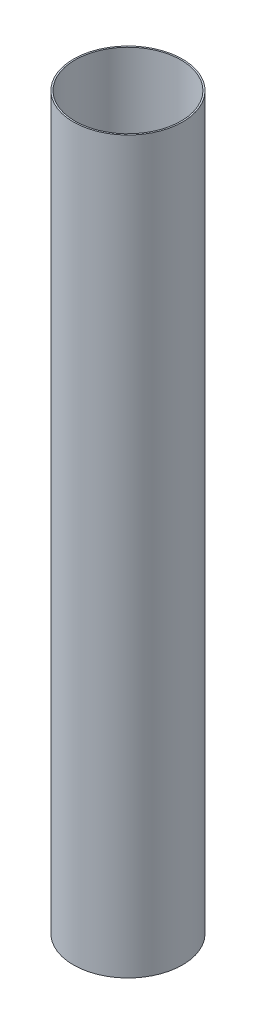
ISO-10303-21;
HEADER;
FILE_DESCRIPTION(('STEP AP214'),'2;1');
FILE_NAME('part.step','',(''),(''),'','','');
FILE_SCHEMA(('AUTOMOTIVE_DESIGN { 1 0 10303 214 1 1 1 1 }'));
ENDSEC;
DATA;
#1=APPLICATION_CONTEXT('core data for automotive mechanical design processes');
#2=APPLICATION_PROTOCOL_DEFINITION('international standard','automotive_design',2000,#1);
#3=PRODUCT_CONTEXT('',#1,'mechanical');
#4=PRODUCT('Part','Part','',(#3));
#5=PRODUCT_RELATED_PRODUCT_CATEGORY('part','',(#4));
#6=PRODUCT_DEFINITION_FORMATION('','',#4);
#7=PRODUCT_DEFINITION_CONTEXT('part definition',#1,'design');
#8=PRODUCT_DEFINITION('design','',#6,#7);
#9=PRODUCT_DEFINITION_SHAPE('','',#8);
#10=(LENGTH_UNIT() NAMED_UNIT(*) SI_UNIT(.MILLI.,.METRE.));
#11=(NAMED_UNIT(*) PLANE_ANGLE_UNIT() SI_UNIT($,.RADIAN.));
#12=(NAMED_UNIT(*) SI_UNIT($,.STERADIAN.) SOLID_ANGLE_UNIT());
#13=UNCERTAINTY_MEASURE_WITH_UNIT(LENGTH_MEASURE(1.E-05),#10,'distance_accuracy_value','');
#14=(GEOMETRIC_REPRESENTATION_CONTEXT(3) GLOBAL_UNCERTAINTY_ASSIGNED_CONTEXT((#13)) GLOBAL_UNIT_ASSIGNED_CONTEXT((#10,
#11,#12)) REPRESENTATION_CONTEXT('',''));
#15=CARTESIAN_POINT('',(0.,0.,0.));
#16=DIRECTION('',(0.,0.,1.));
#17=DIRECTION('',(1.,0.,0.));
#18=AXIS2_PLACEMENT_3D('',#15,#16,#17);
#19=CARTESIAN_POINT('',(0.,104.902,0.));
#20=DIRECTION('',(0.,1.,0.));
#21=DIRECTION('',(0.,0.,1.));
#22=AXIS2_PLACEMENT_3D('',#19,#20,#21);
#23=PLANE('',#22);
#24=CARTESIAN_POINT('',(0.,104.902,0.));
#25=DIRECTION('',(0.,1.,0.));
#26=DIRECTION('',(0.,0.,1.));
#27=AXIS2_PLACEMENT_3D('',#24,#25,#26);
#28=CIRCLE('',#27,7.8359);
#29=CARTESIAN_POINT('',(0.,104.902,7.8359));
#30=VERTEX_POINT('',#29);
#31=EDGE_CURVE('E10',#30,#30,#28,.T.);
#32=ORIENTED_EDGE('',*,*,#31,.T.);
#33=EDGE_LOOP('',(#32));
#34=FACE_BOUND('',#33,.T.);
#35=CARTESIAN_POINT('',(0.,104.902,0.));
#36=DIRECTION('',(0.,1.,0.));
#37=DIRECTION('',(0.,0.,1.));
#38=AXIS2_PLACEMENT_3D('',#35,#36,#37);
#39=CIRCLE('',#38,7.62);
#40=CARTESIAN_POINT('',(0.,104.902,7.62));
#41=VERTEX_POINT('',#40);
#42=EDGE_CURVE('E46',#41,#41,#39,.T.);
#43=ORIENTED_EDGE('',*,*,#42,.F.);
#44=EDGE_LOOP('',(#43));
#45=FACE_BOUND('',#44,.T.);
#46=ADVANCED_FACE('F35',(#34,#45),#23,.T.);
#47=CARTESIAN_POINT('',(0.,0.,0.));
#48=DIRECTION('',(0.,1.,0.));
#49=DIRECTION('',(0.,0.,1.));
#50=AXIS2_PLACEMENT_3D('',#47,#48,#49);
#51=PLANE('',#50);
#52=CARTESIAN_POINT('',(0.,0.,0.));
#53=DIRECTION('',(0.,1.,0.));
#54=DIRECTION('',(0.,0.,1.));
#55=AXIS2_PLACEMENT_3D('',#52,#53,#54);
#56=CIRCLE('',#55,7.8359);
#57=CARTESIAN_POINT('',(0.,0.,7.8359));
#58=VERTEX_POINT('',#57);
#59=EDGE_CURVE('E39',#58,#58,#56,.T.);
#60=ORIENTED_EDGE('',*,*,#59,.F.);
#61=EDGE_LOOP('',(#60));
#62=FACE_BOUND('',#61,.T.);
#63=CARTESIAN_POINT('',(0.,0.,0.));
#64=DIRECTION('',(0.,1.,0.));
#65=DIRECTION('',(0.,0.,1.));
#66=AXIS2_PLACEMENT_3D('',#63,#64,#65);
#67=CIRCLE('',#66,7.62);
#68=CARTESIAN_POINT('',(0.,0.,7.62));
#69=VERTEX_POINT('',#68);
#70=EDGE_CURVE('E48',#69,#69,#67,.T.);
#71=ORIENTED_EDGE('',*,*,#70,.T.);
#72=EDGE_LOOP('',(#71));
#73=FACE_BOUND('',#72,.T.);
#74=ADVANCED_FACE('F58',(#62,#73),#51,.F.);
#75=CARTESIAN_POINT('',(0.,104.902,0.));
#76=DIRECTION('',(0.,-1.,0.));
#77=DIRECTION('',(0.,0.,-1.));
#78=AXIS2_PLACEMENT_3D('',#75,#76,#77);
#79=CYLINDRICAL_SURFACE('',#78,7.8359);
#80=ORIENTED_EDGE('',*,*,#31,.F.);
#81=EDGE_LOOP('',(#80));
#82=FACE_BOUND('',#81,.T.);
#83=ORIENTED_EDGE('',*,*,#59,.T.);
#84=EDGE_LOOP('',(#83));
#85=FACE_BOUND('',#84,.T.);
#86=ADVANCED_FACE('F37',(#82,#85),#79,.T.);
#87=CARTESIAN_POINT('',(0.,104.902,0.));
#88=DIRECTION('',(0.,-1.,0.));
#89=DIRECTION('',(0.,0.,-1.));
#90=AXIS2_PLACEMENT_3D('',#87,#88,#89);
#91=CYLINDRICAL_SURFACE('',#90,7.62);
#92=ORIENTED_EDGE('',*,*,#42,.T.);
#93=EDGE_LOOP('',(#92));
#94=FACE_BOUND('',#93,.T.);
#95=ORIENTED_EDGE('',*,*,#70,.F.);
#96=EDGE_LOOP('',(#95));
#97=FACE_BOUND('',#96,.T.);
#98=ADVANCED_FACE('F54',(#94,#97),#91,.F.);
#99=CLOSED_SHELL('',(#46,#74,#86,#98));
#100=MANIFOLD_SOLID_BREP('B2',#99);
#101=ADVANCED_BREP_SHAPE_REPRESENTATION('',(#18,#100),#14);
#102=SHAPE_DEFINITION_REPRESENTATION(#9,#101);
ENDSEC;
END-ISO-10303-21;
